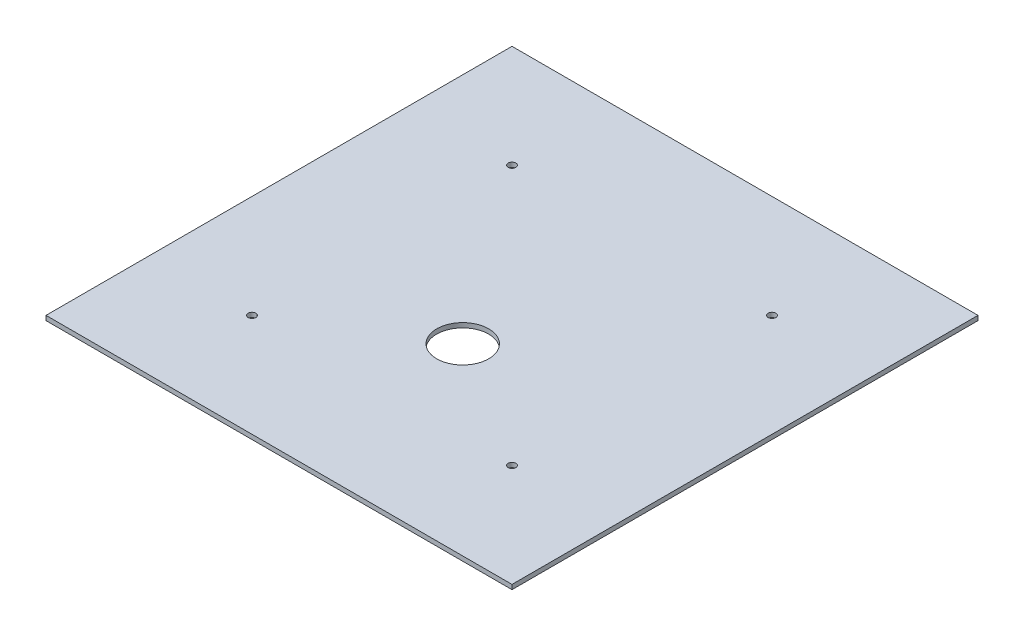
ISO-10303-21;
HEADER;
FILE_DESCRIPTION(('STEP AP214'),'2;1');
FILE_NAME('part.step','',(''),(''),'','','');
FILE_SCHEMA(('AUTOMOTIVE_DESIGN { 1 0 10303 214 1 1 1 1 }'));
ENDSEC;
DATA;
#1=APPLICATION_CONTEXT('core data for automotive mechanical design processes');
#2=APPLICATION_PROTOCOL_DEFINITION('international standard','automotive_design',2000,#1);
#3=PRODUCT_CONTEXT('',#1,'mechanical');
#4=PRODUCT('Part','Part','',(#3));
#5=PRODUCT_RELATED_PRODUCT_CATEGORY('part','',(#4));
#6=PRODUCT_DEFINITION_FORMATION('','',#4);
#7=PRODUCT_DEFINITION_CONTEXT('part definition',#1,'design');
#8=PRODUCT_DEFINITION('design','',#6,#7);
#9=PRODUCT_DEFINITION_SHAPE('','',#8);
#10=(LENGTH_UNIT() NAMED_UNIT(*) SI_UNIT(.MILLI.,.METRE.));
#11=(NAMED_UNIT(*) PLANE_ANGLE_UNIT() SI_UNIT($,.RADIAN.));
#12=(NAMED_UNIT(*) SI_UNIT($,.STERADIAN.) SOLID_ANGLE_UNIT());
#13=UNCERTAINTY_MEASURE_WITH_UNIT(LENGTH_MEASURE(1.E-05),#10,'distance_accuracy_value','');
#14=(GEOMETRIC_REPRESENTATION_CONTEXT(3) GLOBAL_UNCERTAINTY_ASSIGNED_CONTEXT((#13)) GLOBAL_UNIT_ASSIGNED_CONTEXT((#10,
#11,#12)) REPRESENTATION_CONTEXT('',''));
#15=CARTESIAN_POINT('',(0.,0.,0.));
#16=DIRECTION('',(0.,0.,1.));
#17=DIRECTION('',(1.,0.,0.));
#18=AXIS2_PLACEMENT_3D('',#15,#16,#17);
#19=CARTESIAN_POINT('',(152.4,3.,152.4));
#20=DIRECTION('',(-1.,0.,0.));
#21=DIRECTION('',(0.,0.,1.));
#22=AXIS2_PLACEMENT_3D('',#19,#20,#21);
#23=PLANE('',#22);
#24=DIRECTION('',(0.,0.,-1.));
#25=VECTOR('',#24,1.);
#26=CARTESIAN_POINT('',(152.4,0.,152.4));
#27=LINE('',#26,#25);
#28=CARTESIAN_POINT('',(152.4,0.,152.4));
#29=VERTEX_POINT('',#28);
#30=CARTESIAN_POINT('',(152.4,0.,-152.4));
#31=VERTEX_POINT('',#30);
#32=EDGE_CURVE('E105',#29,#31,#27,.T.);
#33=ORIENTED_EDGE('',*,*,#32,.T.);
#34=DIRECTION('',(0.,-1.,0.));
#35=VECTOR('',#34,1.);
#36=CARTESIAN_POINT('',(152.4,3.,-152.4));
#37=LINE('',#36,#35);
#38=CARTESIAN_POINT('',(152.4,3.,-152.4));
#39=VERTEX_POINT('',#38);
#40=EDGE_CURVE('E11',#39,#31,#37,.T.);
#41=ORIENTED_EDGE('',*,*,#40,.F.);
#42=DIRECTION('',(0.,0.,-1.));
#43=VECTOR('',#42,1.);
#44=CARTESIAN_POINT('',(152.4,3.,152.4));
#45=LINE('',#44,#43);
#46=CARTESIAN_POINT('',(152.4,3.,152.4));
#47=VERTEX_POINT('',#46);
#48=EDGE_CURVE('E93',#47,#39,#45,.T.);
#49=ORIENTED_EDGE('',*,*,#48,.F.);
#50=DIRECTION('',(0.,-1.,0.));
#51=VECTOR('',#50,1.);
#52=CARTESIAN_POINT('',(152.4,3.,152.4));
#53=LINE('',#52,#51);
#54=EDGE_CURVE('E101',#47,#29,#53,.T.);
#55=ORIENTED_EDGE('',*,*,#54,.T.);
#56=EDGE_LOOP('',(#33,#41,#49,#55));
#57=FACE_BOUND('',#56,.T.);
#58=ADVANCED_FACE('F42',(#57),#23,.F.);
#59=CARTESIAN_POINT('',(-152.4,3.,-152.4));
#60=DIRECTION('',(0.,0.,1.));
#61=DIRECTION('',(1.,0.,0.));
#62=AXIS2_PLACEMENT_3D('',#59,#60,#61);
#63=PLANE('',#62);
#64=DIRECTION('',(-1.,0.,0.));
#65=VECTOR('',#64,1.);
#66=CARTESIAN_POINT('',(-152.4,0.,-152.4));
#67=LINE('',#66,#65);
#68=CARTESIAN_POINT('',(-152.4,0.,-152.4));
#69=VERTEX_POINT('',#68);
#70=EDGE_CURVE('E97',#31,#69,#67,.T.);
#71=ORIENTED_EDGE('',*,*,#70,.T.);
#72=DIRECTION('',(0.,-1.,0.));
#73=VECTOR('',#72,1.);
#74=CARTESIAN_POINT('',(-152.4,3.,-152.4));
#75=LINE('',#74,#73);
#76=CARTESIAN_POINT('',(-152.4,3.,-152.4));
#77=VERTEX_POINT('',#76);
#78=EDGE_CURVE('E50',#77,#69,#75,.T.);
#79=ORIENTED_EDGE('',*,*,#78,.F.);
#80=DIRECTION('',(-1.,0.,0.));
#81=VECTOR('',#80,1.);
#82=CARTESIAN_POINT('',(-152.4,3.,-152.4));
#83=LINE('',#82,#81);
#84=EDGE_CURVE('E88',#39,#77,#83,.T.);
#85=ORIENTED_EDGE('',*,*,#84,.F.);
#86=ORIENTED_EDGE('',*,*,#40,.T.);
#87=EDGE_LOOP('',(#71,#79,#85,#86));
#88=FACE_BOUND('',#87,.T.);
#89=ADVANCED_FACE('F96',(#88),#63,.F.);
#90=CARTESIAN_POINT('',(-152.4,3.,152.4));
#91=DIRECTION('',(1.,0.,0.));
#92=DIRECTION('',(0.,0.,-1.));
#93=AXIS2_PLACEMENT_3D('',#90,#91,#92);
#94=PLANE('',#93);
#95=DIRECTION('',(0.,0.,1.));
#96=VECTOR('',#95,1.);
#97=CARTESIAN_POINT('',(-152.4,0.,152.4));
#98=LINE('',#97,#96);
#99=CARTESIAN_POINT('',(-152.4,0.,152.4));
#100=VERTEX_POINT('',#99);
#101=EDGE_CURVE('E75',#69,#100,#98,.T.);
#102=ORIENTED_EDGE('',*,*,#101,.T.);
#103=DIRECTION('',(0.,-1.,0.));
#104=VECTOR('',#103,1.);
#105=CARTESIAN_POINT('',(-152.4,3.,152.4));
#106=LINE('',#105,#104);
#107=CARTESIAN_POINT('',(-152.4,3.,152.4));
#108=VERTEX_POINT('',#107);
#109=EDGE_CURVE('E98',#108,#100,#106,.T.);
#110=ORIENTED_EDGE('',*,*,#109,.F.);
#111=DIRECTION('',(0.,0.,1.));
#112=VECTOR('',#111,1.);
#113=CARTESIAN_POINT('',(-152.4,3.,152.4));
#114=LINE('',#113,#112);
#115=EDGE_CURVE('E91',#77,#108,#114,.T.);
#116=ORIENTED_EDGE('',*,*,#115,.F.);
#117=ORIENTED_EDGE('',*,*,#78,.T.);
#118=EDGE_LOOP('',(#102,#110,#116,#117));
#119=FACE_BOUND('',#118,.T.);
#120=ADVANCED_FACE('F99',(#119),#94,.F.);
#121=CARTESIAN_POINT('',(-152.4,3.,152.4));
#122=DIRECTION('',(0.,0.,-1.));
#123=DIRECTION('',(-1.,0.,0.));
#124=AXIS2_PLACEMENT_3D('',#121,#122,#123);
#125=PLANE('',#124);
#126=DIRECTION('',(1.,0.,0.));
#127=VECTOR('',#126,1.);
#128=CARTESIAN_POINT('',(-152.4,0.,152.4));
#129=LINE('',#128,#127);
#130=EDGE_CURVE('E81',#100,#29,#129,.T.);
#131=ORIENTED_EDGE('',*,*,#130,.T.);
#132=ORIENTED_EDGE('',*,*,#54,.F.);
#133=DIRECTION('',(1.,0.,0.));
#134=VECTOR('',#133,1.);
#135=CARTESIAN_POINT('',(-152.4,3.,152.4));
#136=LINE('',#135,#134);
#137=EDGE_CURVE('E58',#108,#47,#136,.T.);
#138=ORIENTED_EDGE('',*,*,#137,.F.);
#139=ORIENTED_EDGE('',*,*,#109,.T.);
#140=EDGE_LOOP('',(#131,#132,#138,#139));
#141=FACE_BOUND('',#140,.T.);
#142=ADVANCED_FACE('F113',(#141),#125,.F.);
#143=CARTESIAN_POINT('',(0.,3.,0.));
#144=DIRECTION('',(0.,-1.,0.));
#145=DIRECTION('',(0.,0.,-1.));
#146=AXIS2_PLACEMENT_3D('',#143,#144,#145);
#147=PLANE('',#146);
#148=CARTESIAN_POINT('',(0.,3.,32.24));
#149=DIRECTION('',(0.,1.,0.));
#150=DIRECTION('',(0.,0.,1.));
#151=AXIS2_PLACEMENT_3D('',#148,#149,#150);
#152=CIRCLE('',#151,17.);
#153=CARTESIAN_POINT('',(0.,3.,49.24));
#154=VERTEX_POINT('',#153);
#155=EDGE_CURVE('E143',#154,#154,#152,.T.);
#156=ORIENTED_EDGE('',*,*,#155,.F.);
#157=EDGE_LOOP('',(#156));
#158=FACE_BOUND('',#157,.T.);
#159=CARTESIAN_POINT('',(85.035,3.,-85.035));
#160=DIRECTION('',(0.,1.,0.));
#161=DIRECTION('',(0.,0.,1.));
#162=AXIS2_PLACEMENT_3D('',#159,#160,#161);
#163=CIRCLE('',#162,2.5);
#164=CARTESIAN_POINT('',(85.035,3.,-82.535));
#165=VERTEX_POINT('',#164);
#166=EDGE_CURVE('E122',#165,#165,#163,.T.);
#167=ORIENTED_EDGE('',*,*,#166,.F.);
#168=EDGE_LOOP('',(#167));
#169=FACE_BOUND('',#168,.T.);
#170=CARTESIAN_POINT('',(-85.035,3.,85.035));
#171=DIRECTION('',(0.,1.,0.));
#172=DIRECTION('',(0.,0.,1.));
#173=AXIS2_PLACEMENT_3D('',#170,#171,#172);
#174=CIRCLE('',#173,2.5);
#175=CARTESIAN_POINT('',(-85.035,3.,87.535));
#176=VERTEX_POINT('',#175);
#177=EDGE_CURVE('E128',#176,#176,#174,.T.);
#178=ORIENTED_EDGE('',*,*,#177,.F.);
#179=EDGE_LOOP('',(#178));
#180=FACE_BOUND('',#179,.T.);
#181=CARTESIAN_POINT('',(85.035,3.,85.035));
#182=DIRECTION('',(0.,1.,0.));
#183=DIRECTION('',(0.,0.,1.));
#184=AXIS2_PLACEMENT_3D('',#181,#182,#183);
#185=CIRCLE('',#184,2.5);
#186=CARTESIAN_POINT('',(85.035,3.,87.535));
#187=VERTEX_POINT('',#186);
#188=EDGE_CURVE('E129',#187,#187,#185,.T.);
#189=ORIENTED_EDGE('',*,*,#188,.F.);
#190=EDGE_LOOP('',(#189));
#191=FACE_BOUND('',#190,.T.);
#192=CARTESIAN_POINT('',(-85.035,3.,-85.035));
#193=DIRECTION('',(0.,1.,0.));
#194=DIRECTION('',(0.,0.,1.));
#195=AXIS2_PLACEMENT_3D('',#192,#193,#194);
#196=CIRCLE('',#195,2.5);
#197=CARTESIAN_POINT('',(-85.035,3.,-82.535));
#198=VERTEX_POINT('',#197);
#199=EDGE_CURVE('E119',#198,#198,#196,.T.);
#200=ORIENTED_EDGE('',*,*,#199,.F.);
#201=EDGE_LOOP('',(#200));
#202=FACE_BOUND('',#201,.T.);
#203=ORIENTED_EDGE('',*,*,#48,.T.);
#204=ORIENTED_EDGE('',*,*,#84,.T.);
#205=ORIENTED_EDGE('',*,*,#115,.T.);
#206=ORIENTED_EDGE('',*,*,#137,.T.);
#207=EDGE_LOOP('',(#203,#204,#205,#206));
#208=FACE_BOUND('',#207,.T.);
#209=ADVANCED_FACE('F89',(#158,#169,#180,#191,#202,#208),#147,.F.);
#210=CARTESIAN_POINT('',(0.,0.,0.));
#211=DIRECTION('',(0.,-1.,0.));
#212=DIRECTION('',(0.,0.,-1.));
#213=AXIS2_PLACEMENT_3D('',#210,#211,#212);
#214=PLANE('',#213);
#215=CARTESIAN_POINT('',(0.,0.,32.24));
#216=DIRECTION('',(0.,1.,0.));
#217=DIRECTION('',(0.,0.,1.));
#218=AXIS2_PLACEMENT_3D('',#215,#216,#217);
#219=CIRCLE('',#218,17.);
#220=CARTESIAN_POINT('',(0.,0.,49.24));
#221=VERTEX_POINT('',#220);
#222=EDGE_CURVE('E140',#221,#221,#219,.T.);
#223=ORIENTED_EDGE('',*,*,#222,.T.);
#224=EDGE_LOOP('',(#223));
#225=FACE_BOUND('',#224,.T.);
#226=CARTESIAN_POINT('',(85.035,0.,-85.035));
#227=DIRECTION('',(0.,1.,0.));
#228=DIRECTION('',(0.,0.,1.));
#229=AXIS2_PLACEMENT_3D('',#226,#227,#228);
#230=CIRCLE('',#229,2.5);
#231=CARTESIAN_POINT('',(85.035,0.,-82.535));
#232=VERTEX_POINT('',#231);
#233=EDGE_CURVE('E132',#232,#232,#230,.T.);
#234=ORIENTED_EDGE('',*,*,#233,.T.);
#235=EDGE_LOOP('',(#234));
#236=FACE_BOUND('',#235,.T.);
#237=CARTESIAN_POINT('',(-85.035,0.,85.035));
#238=DIRECTION('',(0.,1.,0.));
#239=DIRECTION('',(0.,0.,1.));
#240=AXIS2_PLACEMENT_3D('',#237,#238,#239);
#241=CIRCLE('',#240,2.5);
#242=CARTESIAN_POINT('',(-85.035,0.,87.535));
#243=VERTEX_POINT('',#242);
#244=EDGE_CURVE('E125',#243,#243,#241,.T.);
#245=ORIENTED_EDGE('',*,*,#244,.T.);
#246=EDGE_LOOP('',(#245));
#247=FACE_BOUND('',#246,.T.);
#248=CARTESIAN_POINT('',(85.035,0.,85.035));
#249=DIRECTION('',(0.,1.,0.));
#250=DIRECTION('',(0.,0.,1.));
#251=AXIS2_PLACEMENT_3D('',#248,#249,#250);
#252=CIRCLE('',#251,2.5);
#253=CARTESIAN_POINT('',(85.035,0.,87.535));
#254=VERTEX_POINT('',#253);
#255=EDGE_CURVE('E137',#254,#254,#252,.T.);
#256=ORIENTED_EDGE('',*,*,#255,.T.);
#257=EDGE_LOOP('',(#256));
#258=FACE_BOUND('',#257,.T.);
#259=CARTESIAN_POINT('',(-85.035,0.,-85.035));
#260=DIRECTION('',(0.,1.,0.));
#261=DIRECTION('',(0.,0.,1.));
#262=AXIS2_PLACEMENT_3D('',#259,#260,#261);
#263=CIRCLE('',#262,2.5);
#264=CARTESIAN_POINT('',(-85.035,0.,-82.535));
#265=VERTEX_POINT('',#264);
#266=EDGE_CURVE('E108',#265,#265,#263,.T.);
#267=ORIENTED_EDGE('',*,*,#266,.T.);
#268=EDGE_LOOP('',(#267));
#269=FACE_BOUND('',#268,.T.);
#270=ORIENTED_EDGE('',*,*,#32,.F.);
#271=ORIENTED_EDGE('',*,*,#130,.F.);
#272=ORIENTED_EDGE('',*,*,#101,.F.);
#273=ORIENTED_EDGE('',*,*,#70,.F.);
#274=EDGE_LOOP('',(#270,#271,#272,#273));
#275=FACE_BOUND('',#274,.T.);
#276=ADVANCED_FACE('F116',(#225,#236,#247,#258,#269,#275),#214,.T.);
#277=CARTESIAN_POINT('',(-85.035,0.,-85.035));
#278=DIRECTION('',(0.,1.,0.));
#279=DIRECTION('',(0.,0.,1.));
#280=AXIS2_PLACEMENT_3D('',#277,#278,#279);
#281=CYLINDRICAL_SURFACE('',#280,2.5);
#282=ORIENTED_EDGE('',*,*,#266,.F.);
#283=EDGE_LOOP('',(#282));
#284=FACE_BOUND('',#283,.T.);
#285=ORIENTED_EDGE('',*,*,#199,.T.);
#286=EDGE_LOOP('',(#285));
#287=FACE_BOUND('',#286,.T.);
#288=ADVANCED_FACE('F169',(#284,#287),#281,.F.);
#289=CARTESIAN_POINT('',(85.035,0.,85.035));
#290=DIRECTION('',(0.,1.,0.));
#291=DIRECTION('',(0.,0.,1.));
#292=AXIS2_PLACEMENT_3D('',#289,#290,#291);
#293=CYLINDRICAL_SURFACE('',#292,2.5);
#294=ORIENTED_EDGE('',*,*,#255,.F.);
#295=EDGE_LOOP('',(#294));
#296=FACE_BOUND('',#295,.T.);
#297=ORIENTED_EDGE('',*,*,#188,.T.);
#298=EDGE_LOOP('',(#297));
#299=FACE_BOUND('',#298,.T.);
#300=ADVANCED_FACE('F171',(#296,#299),#293,.F.);
#301=CARTESIAN_POINT('',(-85.035,0.,85.035));
#302=DIRECTION('',(0.,1.,0.));
#303=DIRECTION('',(0.,0.,1.));
#304=AXIS2_PLACEMENT_3D('',#301,#302,#303);
#305=CYLINDRICAL_SURFACE('',#304,2.5);
#306=ORIENTED_EDGE('',*,*,#244,.F.);
#307=EDGE_LOOP('',(#306));
#308=FACE_BOUND('',#307,.T.);
#309=ORIENTED_EDGE('',*,*,#177,.T.);
#310=EDGE_LOOP('',(#309));
#311=FACE_BOUND('',#310,.T.);
#312=ADVANCED_FACE('F178',(#308,#311),#305,.F.);
#313=CARTESIAN_POINT('',(85.035,0.,-85.035));
#314=DIRECTION('',(0.,1.,0.));
#315=DIRECTION('',(0.,0.,1.));
#316=AXIS2_PLACEMENT_3D('',#313,#314,#315);
#317=CYLINDRICAL_SURFACE('',#316,2.5);
#318=ORIENTED_EDGE('',*,*,#233,.F.);
#319=EDGE_LOOP('',(#318));
#320=FACE_BOUND('',#319,.T.);
#321=ORIENTED_EDGE('',*,*,#166,.T.);
#322=EDGE_LOOP('',(#321));
#323=FACE_BOUND('',#322,.T.);
#324=ADVANCED_FACE('F154',(#320,#323),#317,.F.);
#325=CARTESIAN_POINT('',(0.,0.,32.24));
#326=DIRECTION('',(0.,1.,0.));
#327=DIRECTION('',(0.,0.,1.));
#328=AXIS2_PLACEMENT_3D('',#325,#326,#327);
#329=CYLINDRICAL_SURFACE('',#328,17.);
#330=ORIENTED_EDGE('',*,*,#222,.F.);
#331=EDGE_LOOP('',(#330));
#332=FACE_BOUND('',#331,.T.);
#333=ORIENTED_EDGE('',*,*,#155,.T.);
#334=EDGE_LOOP('',(#333));
#335=FACE_BOUND('',#334,.T.);
#336=ADVANCED_FACE('F151',(#332,#335),#329,.F.);
#337=CLOSED_SHELL('',(#58,#89,#120,#142,#209,#276,#288,#300,#312,#324,#336));
#338=MANIFOLD_SOLID_BREP('B2',#337);
#339=ADVANCED_BREP_SHAPE_REPRESENTATION('',(#18,#338),#14);
#340=SHAPE_DEFINITION_REPRESENTATION(#9,#339);
ENDSEC;
END-ISO-10303-21;
